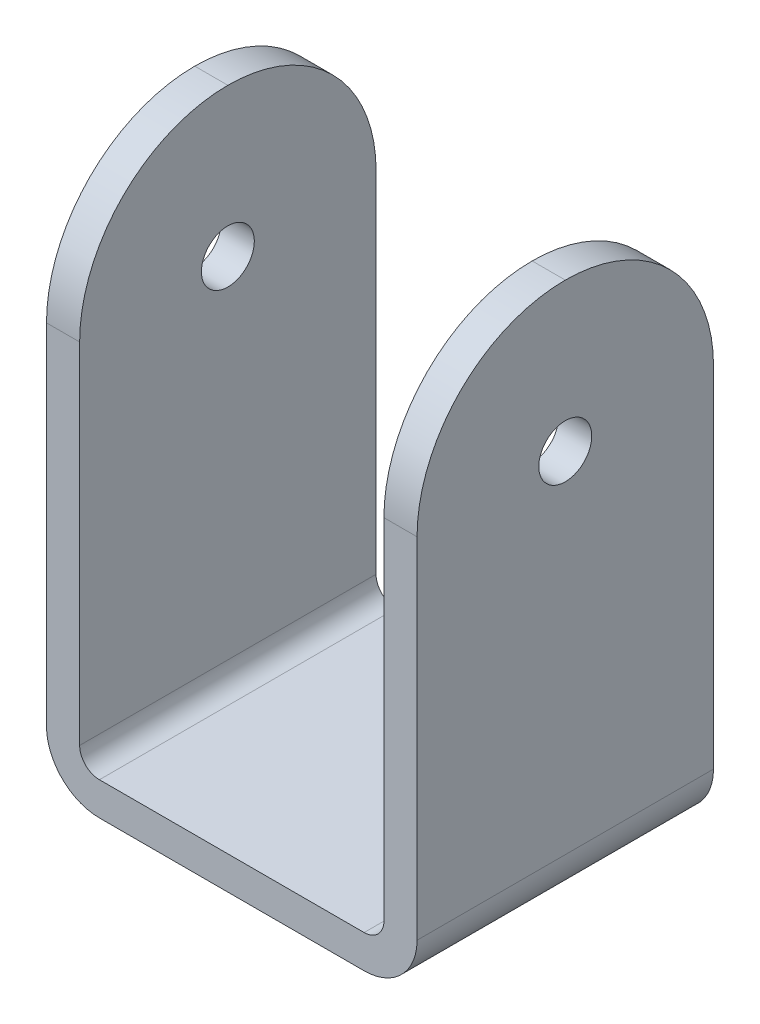
ISO-10303-21;
HEADER;
FILE_DESCRIPTION(('STEP AP214'),'2;1');
FILE_NAME('part.step','',(''),(''),'','','');
FILE_SCHEMA(('AUTOMOTIVE_DESIGN { 1 0 10303 214 1 1 1 1 }'));
ENDSEC;
DATA;
#1=APPLICATION_CONTEXT('core data for automotive mechanical design processes');
#2=APPLICATION_PROTOCOL_DEFINITION('international standard','automotive_design',2000,#1);
#3=PRODUCT_CONTEXT('',#1,'mechanical');
#4=PRODUCT('Part','Part','',(#3));
#5=PRODUCT_RELATED_PRODUCT_CATEGORY('part','',(#4));
#6=PRODUCT_DEFINITION_FORMATION('','',#4);
#7=PRODUCT_DEFINITION_CONTEXT('part definition',#1,'design');
#8=PRODUCT_DEFINITION('design','',#6,#7);
#9=PRODUCT_DEFINITION_SHAPE('','',#8);
#10=(LENGTH_UNIT() NAMED_UNIT(*) SI_UNIT(.MILLI.,.METRE.));
#11=(NAMED_UNIT(*) PLANE_ANGLE_UNIT() SI_UNIT($,.RADIAN.));
#12=(NAMED_UNIT(*) SI_UNIT($,.STERADIAN.) SOLID_ANGLE_UNIT());
#13=UNCERTAINTY_MEASURE_WITH_UNIT(LENGTH_MEASURE(1.E-05),#10,'distance_accuracy_value','');
#14=(GEOMETRIC_REPRESENTATION_CONTEXT(3) GLOBAL_UNCERTAINTY_ASSIGNED_CONTEXT((#13)) GLOBAL_UNIT_ASSIGNED_CONTEXT((#10,
#11,#12)) REPRESENTATION_CONTEXT('',''));
#15=CARTESIAN_POINT('',(0.,0.,0.));
#16=DIRECTION('',(0.,0.,1.));
#17=DIRECTION('',(1.,0.,0.));
#18=AXIS2_PLACEMENT_3D('',#15,#16,#17);
#19=CARTESIAN_POINT('',(-144.822728971963,103.115454205607,71.12));
#20=DIRECTION('',(1.,0.,0.));
#21=DIRECTION('',(0.,1.,0.));
#22=AXIS2_PLACEMENT_3D('',#19,#20,#21);
#23=PLANE('',#22);
#24=CARTESIAN_POINT('',(-144.822728971963,67.5554542056074,35.56));
#25=DIRECTION('',(1.,0.,0.));
#26=DIRECTION('',(0.,0.,-1.));
#27=AXIS2_PLACEMENT_3D('',#24,#25,#26);
#28=CIRCLE('',#27,6.35);
#29=CARTESIAN_POINT('',(-144.822728971963,67.5554542056074,29.21));
#30=VERTEX_POINT('',#29);
#31=EDGE_CURVE('E246',#30,#30,#28,.T.);
#32=ORIENTED_EDGE('',*,*,#31,.T.);
#33=EDGE_LOOP('',(#32));
#34=FACE_BOUND('',#33,.T.);
#35=CARTESIAN_POINT('',(-144.822728971962,67.5554542056074,35.56));
#36=DIRECTION('',(1.,0.,0.));
#37=DIRECTION('',(0.,1.,0.));
#38=AXIS2_PLACEMENT_3D('',#35,#36,#37);
#39=CIRCLE('',#38,35.56);
#40=CARTESIAN_POINT('',(-144.822728971962,67.5554542056074,71.12));
#41=VERTEX_POINT('',#40);
#42=CARTESIAN_POINT('',(-144.822728971963,103.115454205607,35.56));
#43=VERTEX_POINT('',#42);
#44=EDGE_CURVE('E57',#41,#43,#39,.F.);
#45=ORIENTED_EDGE('',*,*,#44,.T.);
#46=CARTESIAN_POINT('',(-144.822728971962,67.5554542056074,35.56));
#47=DIRECTION('',(1.,0.,0.));
#48=DIRECTION('',(0.,1.,0.));
#49=AXIS2_PLACEMENT_3D('',#46,#47,#48);
#50=CIRCLE('',#49,35.56);
#51=CARTESIAN_POINT('',(-144.822728971962,67.5554542056074,0.));
#52=VERTEX_POINT('',#51);
#53=EDGE_CURVE('E233',#43,#52,#50,.F.);
#54=ORIENTED_EDGE('',*,*,#53,.T.);
#55=DIRECTION('',(0.,-1.,0.));
#56=VECTOR('',#55,1.);
#57=CARTESIAN_POINT('',(-144.822728971963,103.115454205607,0.));
#58=LINE('',#57,#56);
#59=CARTESIAN_POINT('',(-144.822728971962,-16.2645457943926,0.));
#60=VERTEX_POINT('',#59);
#61=EDGE_CURVE('E149',#52,#60,#58,.T.);
#62=ORIENTED_EDGE('',*,*,#61,.T.);
#63=DIRECTION('',(0.,0.,-1.));
#64=VECTOR('',#63,1.);
#65=CARTESIAN_POINT('',(-144.822728971962,-16.2645457943926,71.12));
#66=LINE('',#65,#64);
#67=CARTESIAN_POINT('',(-144.822728971962,-16.2645457943926,71.12));
#68=VERTEX_POINT('',#67);
#69=EDGE_CURVE('E147',#68,#60,#66,.T.);
#70=ORIENTED_EDGE('',*,*,#69,.F.);
#71=DIRECTION('',(0.,-1.,0.));
#72=VECTOR('',#71,1.);
#73=CARTESIAN_POINT('',(-144.822728971963,103.115454205607,71.12));
#74=LINE('',#73,#72);
#75=EDGE_CURVE('E134',#41,#68,#74,.T.);
#76=ORIENTED_EDGE('',*,*,#75,.F.);
#77=EDGE_LOOP('',(#45,#54,#62,#70,#76));
#78=FACE_BOUND('',#77,.T.);
#79=ADVANCED_FACE('F34',(#34,#78),#23,.F.);
#80=CARTESIAN_POINT('',(-132.122728971962,-16.2645457943926,71.12));
#81=DIRECTION('',(0.,0.,-1.));
#82=DIRECTION('',(-1.,0.,0.));
#83=AXIS2_PLACEMENT_3D('',#80,#81,#82);
#84=CYLINDRICAL_SURFACE('',#83,12.7);
#85=CARTESIAN_POINT('',(-132.122728971962,-16.2645457943926,0.));
#86=DIRECTION('',(0.,0.,1.));
#87=DIRECTION('',(1.,0.,0.));
#88=AXIS2_PLACEMENT_3D('',#85,#86,#87);
#89=CIRCLE('',#88,12.7);
#90=CARTESIAN_POINT('',(-132.122728971962,-28.9645457943926,0.));
#91=VERTEX_POINT('',#90);
#92=EDGE_CURVE('E178',#60,#91,#89,.T.);
#93=ORIENTED_EDGE('',*,*,#92,.T.);
#94=DIRECTION('',(0.,0.,-1.));
#95=VECTOR('',#94,1.);
#96=CARTESIAN_POINT('',(-132.122728971962,-28.9645457943926,71.12));
#97=LINE('',#96,#95);
#98=CARTESIAN_POINT('',(-132.122728971962,-28.9645457943926,71.12));
#99=VERTEX_POINT('',#98);
#100=EDGE_CURVE('E152',#99,#91,#97,.T.);
#101=ORIENTED_EDGE('',*,*,#100,.F.);
#102=CARTESIAN_POINT('',(-132.122728971962,-16.2645457943926,71.12));
#103=DIRECTION('',(0.,0.,1.));
#104=DIRECTION('',(1.,0.,0.));
#105=AXIS2_PLACEMENT_3D('',#102,#103,#104);
#106=CIRCLE('',#105,12.7);
#107=EDGE_CURVE('E139',#68,#99,#106,.T.);
#108=ORIENTED_EDGE('',*,*,#107,.F.);
#109=ORIENTED_EDGE('',*,*,#69,.T.);
#110=EDGE_LOOP('',(#93,#101,#108,#109));
#111=FACE_BOUND('',#110,.T.);
#112=ADVANCED_FACE('F154',(#111),#84,.T.);
#113=CARTESIAN_POINT('',(-132.122728971962,-28.9645457943926,71.12));
#114=DIRECTION('',(0.,1.,0.));
#115=DIRECTION('',(0.,0.,1.));
#116=AXIS2_PLACEMENT_3D('',#113,#114,#115);
#117=PLANE('',#116);
#118=DIRECTION('',(1.,0.,0.));
#119=VECTOR('',#118,1.);
#120=CARTESIAN_POINT('',(-132.122728971962,-28.9645457943926,0.));
#121=LINE('',#120,#119);
#122=CARTESIAN_POINT('',(-68.6227289719627,-28.9645457943926,0.));
#123=VERTEX_POINT('',#122);
#124=EDGE_CURVE('E181',#91,#123,#121,.T.);
#125=ORIENTED_EDGE('',*,*,#124,.T.);
#126=DIRECTION('',(0.,0.,-1.));
#127=VECTOR('',#126,1.);
#128=CARTESIAN_POINT('',(-68.6227289719627,-28.9645457943926,71.12));
#129=LINE('',#128,#127);
#130=CARTESIAN_POINT('',(-68.6227289719627,-28.9645457943926,71.12));
#131=VERTEX_POINT('',#130);
#132=EDGE_CURVE('E211',#131,#123,#129,.T.);
#133=ORIENTED_EDGE('',*,*,#132,.F.);
#134=DIRECTION('',(1.,0.,0.));
#135=VECTOR('',#134,1.);
#136=CARTESIAN_POINT('',(-132.122728971962,-28.9645457943926,71.12));
#137=LINE('',#136,#135);
#138=EDGE_CURVE('E157',#99,#131,#137,.T.);
#139=ORIENTED_EDGE('',*,*,#138,.F.);
#140=ORIENTED_EDGE('',*,*,#100,.T.);
#141=EDGE_LOOP('',(#125,#133,#139,#140));
#142=FACE_BOUND('',#141,.T.);
#143=ADVANCED_FACE('F288',(#142),#117,.F.);
#144=CARTESIAN_POINT('',(-68.6227289719626,-16.2645457943926,71.12));
#145=DIRECTION('',(0.,0.,-1.));
#146=DIRECTION('',(-1.,0.,0.));
#147=AXIS2_PLACEMENT_3D('',#144,#145,#146);
#148=CYLINDRICAL_SURFACE('',#147,12.7);
#149=CARTESIAN_POINT('',(-68.6227289719626,-16.2645457943926,0.));
#150=DIRECTION('',(0.,0.,1.));
#151=DIRECTION('',(1.,0.,0.));
#152=AXIS2_PLACEMENT_3D('',#149,#150,#151);
#153=CIRCLE('',#152,12.7);
#154=CARTESIAN_POINT('',(-55.9227289719626,-16.2645457943926,0.));
#155=VERTEX_POINT('',#154);
#156=EDGE_CURVE('E183',#123,#155,#153,.T.);
#157=ORIENTED_EDGE('',*,*,#156,.T.);
#158=DIRECTION('',(0.,0.,-1.));
#159=VECTOR('',#158,1.);
#160=CARTESIAN_POINT('',(-55.9227289719626,-16.2645457943926,71.12));
#161=LINE('',#160,#159);
#162=CARTESIAN_POINT('',(-55.9227289719626,-16.2645457943926,71.12));
#163=VERTEX_POINT('',#162);
#164=EDGE_CURVE('E208',#163,#155,#161,.T.);
#165=ORIENTED_EDGE('',*,*,#164,.F.);
#166=CARTESIAN_POINT('',(-68.6227289719626,-16.2645457943926,71.12));
#167=DIRECTION('',(0.,0.,1.));
#168=DIRECTION('',(1.,0.,0.));
#169=AXIS2_PLACEMENT_3D('',#166,#167,#168);
#170=CIRCLE('',#169,12.7);
#171=EDGE_CURVE('E159',#131,#163,#170,.T.);
#172=ORIENTED_EDGE('',*,*,#171,.F.);
#173=ORIENTED_EDGE('',*,*,#132,.T.);
#174=EDGE_LOOP('',(#157,#165,#172,#173));
#175=FACE_BOUND('',#174,.T.);
#176=ADVANCED_FACE('F315',(#175),#148,.T.);
#177=CARTESIAN_POINT('',(-55.9227289719626,-16.2645457943925,71.12));
#178=DIRECTION('',(-1.,0.,0.));
#179=DIRECTION('',(0.,0.,1.));
#180=AXIS2_PLACEMENT_3D('',#177,#178,#179);
#181=PLANE('',#180);
#182=CARTESIAN_POINT('',(-55.9227289719626,67.5554542056074,35.56));
#183=DIRECTION('',(1.,0.,0.));
#184=DIRECTION('',(0.,0.,-1.));
#185=AXIS2_PLACEMENT_3D('',#182,#183,#184);
#186=CIRCLE('',#185,6.35);
#187=CARTESIAN_POINT('',(-55.9227289719626,67.5554542056074,29.21));
#188=VERTEX_POINT('',#187);
#189=EDGE_CURVE('E248',#188,#188,#186,.T.);
#190=ORIENTED_EDGE('',*,*,#189,.F.);
#191=EDGE_LOOP('',(#190));
#192=FACE_BOUND('',#191,.T.);
#193=CARTESIAN_POINT('',(-55.9227289719626,67.5554542056074,35.56));
#194=DIRECTION('',(-1.,0.,0.));
#195=DIRECTION('',(0.,0.,1.));
#196=AXIS2_PLACEMENT_3D('',#193,#194,#195);
#197=CIRCLE('',#196,35.56);
#198=CARTESIAN_POINT('',(-55.9227289719626,67.5554542056074,0.));
#199=VERTEX_POINT('',#198);
#200=CARTESIAN_POINT('',(-55.9227289719626,103.115454205607,35.56));
#201=VERTEX_POINT('',#200);
#202=EDGE_CURVE('E223',#199,#201,#197,.F.);
#203=ORIENTED_EDGE('',*,*,#202,.T.);
#204=CARTESIAN_POINT('',(-55.9227289719626,67.5554542056074,35.56));
#205=DIRECTION('',(-1.,0.,0.));
#206=DIRECTION('',(0.,0.,1.));
#207=AXIS2_PLACEMENT_3D('',#204,#205,#206);
#208=CIRCLE('',#207,35.56);
#209=CARTESIAN_POINT('',(-55.9227289719626,67.5554542056074,71.12));
#210=VERTEX_POINT('',#209);
#211=EDGE_CURVE('E225',#201,#210,#208,.F.);
#212=ORIENTED_EDGE('',*,*,#211,.T.);
#213=DIRECTION('',(0.,1.,0.));
#214=VECTOR('',#213,1.);
#215=CARTESIAN_POINT('',(-55.9227289719626,-16.2645457943925,71.12));
#216=LINE('',#215,#214);
#217=EDGE_CURVE('E164',#163,#210,#216,.T.);
#218=ORIENTED_EDGE('',*,*,#217,.F.);
#219=ORIENTED_EDGE('',*,*,#164,.T.);
#220=DIRECTION('',(0.,1.,0.));
#221=VECTOR('',#220,1.);
#222=CARTESIAN_POINT('',(-55.9227289719626,-16.2645457943925,0.));
#223=LINE('',#222,#221);
#224=EDGE_CURVE('E185',#155,#199,#223,.T.);
#225=ORIENTED_EDGE('',*,*,#224,.T.);
#226=EDGE_LOOP('',(#203,#212,#218,#219,#225));
#227=FACE_BOUND('',#226,.T.);
#228=ADVANCED_FACE('F309',(#192,#227),#181,.F.);
#229=CARTESIAN_POINT('',(-63.8729289719626,-16.2645457943925,71.12));
#230=DIRECTION('',(1.,0.,0.));
#231=DIRECTION('',(0.,0.,-1.));
#232=AXIS2_PLACEMENT_3D('',#229,#230,#231);
#233=PLANE('',#232);
#234=CARTESIAN_POINT('',(-63.8729289719626,67.5554542056074,35.56));
#235=DIRECTION('',(1.,0.,0.));
#236=DIRECTION('',(0.,0.,-1.));
#237=AXIS2_PLACEMENT_3D('',#234,#235,#236);
#238=CIRCLE('',#237,6.35);
#239=CARTESIAN_POINT('',(-63.8729289719626,67.5554542056074,29.21));
#240=VERTEX_POINT('',#239);
#241=EDGE_CURVE('E239',#240,#240,#238,.T.);
#242=ORIENTED_EDGE('',*,*,#241,.T.);
#243=EDGE_LOOP('',(#242));
#244=FACE_BOUND('',#243,.T.);
#245=DIRECTION('',(0.,-1.,0.));
#246=VECTOR('',#245,1.);
#247=CARTESIAN_POINT('',(-63.8729289719626,-16.2645457943925,71.12));
#248=LINE('',#247,#246);
#249=CARTESIAN_POINT('',(-63.8729289719626,67.5554542056074,71.12));
#250=VERTEX_POINT('',#249);
#251=CARTESIAN_POINT('',(-63.8729289719626,-16.2645457943925,71.12));
#252=VERTEX_POINT('',#251);
#253=EDGE_CURVE('E166',#250,#252,#248,.T.);
#254=ORIENTED_EDGE('',*,*,#253,.F.);
#255=CARTESIAN_POINT('',(-63.8729289719626,67.5554542056074,35.56));
#256=DIRECTION('',(1.,0.,0.));
#257=DIRECTION('',(0.,0.,-1.));
#258=AXIS2_PLACEMENT_3D('',#255,#256,#257);
#259=CIRCLE('',#258,35.56);
#260=CARTESIAN_POINT('',(-63.8729289719626,103.115454205607,35.56));
#261=VERTEX_POINT('',#260);
#262=EDGE_CURVE('E221',#250,#261,#259,.F.);
#263=ORIENTED_EDGE('',*,*,#262,.T.);
#264=CARTESIAN_POINT('',(-63.8729289719626,67.5554542056074,35.56));
#265=DIRECTION('',(1.,0.,0.));
#266=DIRECTION('',(0.,0.,-1.));
#267=AXIS2_PLACEMENT_3D('',#264,#265,#266);
#268=CIRCLE('',#267,35.56);
#269=CARTESIAN_POINT('',(-63.8729289719626,67.5554542056074,0.));
#270=VERTEX_POINT('',#269);
#271=EDGE_CURVE('E219',#261,#270,#268,.F.);
#272=ORIENTED_EDGE('',*,*,#271,.T.);
#273=DIRECTION('',(0.,-1.,0.));
#274=VECTOR('',#273,1.);
#275=CARTESIAN_POINT('',(-63.8729289719626,-16.2645457943925,0.));
#276=LINE('',#275,#274);
#277=CARTESIAN_POINT('',(-63.8729289719626,-16.2645457943925,0.));
#278=VERTEX_POINT('',#277);
#279=EDGE_CURVE('E188',#270,#278,#276,.T.);
#280=ORIENTED_EDGE('',*,*,#279,.T.);
#281=DIRECTION('',(0.,0.,-1.));
#282=VECTOR('',#281,1.);
#283=CARTESIAN_POINT('',(-63.8729289719626,-16.2645457943925,71.12));
#284=LINE('',#283,#282);
#285=EDGE_CURVE('E205',#252,#278,#284,.T.);
#286=ORIENTED_EDGE('',*,*,#285,.F.);
#287=EDGE_LOOP('',(#254,#263,#272,#280,#286));
#288=FACE_BOUND('',#287,.T.);
#289=ADVANCED_FACE('F322',(#244,#288),#233,.F.);
#290=CARTESIAN_POINT('',(-68.6227289719626,-16.2645457943926,71.12));
#291=DIRECTION('',(0.,0.,-1.));
#292=DIRECTION('',(-1.,0.,0.));
#293=AXIS2_PLACEMENT_3D('',#290,#291,#292);
#294=CYLINDRICAL_SURFACE('',#293,4.7498);
#295=CARTESIAN_POINT('',(-68.6227289719626,-16.2645457943926,0.));
#296=DIRECTION('',(0.,0.,-1.));
#297=DIRECTION('',(1.,0.,0.));
#298=AXIS2_PLACEMENT_3D('',#295,#296,#297);
#299=CIRCLE('',#298,4.7498);
#300=CARTESIAN_POINT('',(-68.6227289719627,-21.0143457943925,0.));
#301=VERTEX_POINT('',#300);
#302=EDGE_CURVE('E190',#278,#301,#299,.T.);
#303=ORIENTED_EDGE('',*,*,#302,.T.);
#304=DIRECTION('',(0.,0.,-1.));
#305=VECTOR('',#304,1.);
#306=CARTESIAN_POINT('',(-68.6227289719627,-21.0143457943925,71.12));
#307=LINE('',#306,#305);
#308=CARTESIAN_POINT('',(-68.6227289719627,-21.0143457943925,71.12));
#309=VERTEX_POINT('',#308);
#310=EDGE_CURVE('E202',#309,#301,#307,.T.);
#311=ORIENTED_EDGE('',*,*,#310,.F.);
#312=CARTESIAN_POINT('',(-68.6227289719626,-16.2645457943926,71.12));
#313=DIRECTION('',(0.,0.,-1.));
#314=DIRECTION('',(1.,0.,0.));
#315=AXIS2_PLACEMENT_3D('',#312,#313,#314);
#316=CIRCLE('',#315,4.7498);
#317=EDGE_CURVE('E168',#252,#309,#316,.T.);
#318=ORIENTED_EDGE('',*,*,#317,.F.);
#319=ORIENTED_EDGE('',*,*,#285,.T.);
#320=EDGE_LOOP('',(#303,#311,#318,#319));
#321=FACE_BOUND('',#320,.T.);
#322=ADVANCED_FACE('F325',(#321),#294,.F.);
#323=CARTESIAN_POINT('',(-132.122728971962,-21.0143457943926,71.12));
#324=DIRECTION('',(0.,-1.,0.));
#325=DIRECTION('',(1.,0.,0.));
#326=AXIS2_PLACEMENT_3D('',#323,#324,#325);
#327=PLANE('',#326);
#328=DIRECTION('',(-1.,0.,0.));
#329=VECTOR('',#328,1.);
#330=CARTESIAN_POINT('',(-132.122728971962,-21.0143457943926,0.));
#331=LINE('',#330,#329);
#332=CARTESIAN_POINT('',(-132.122728971962,-21.0143457943926,0.));
#333=VERTEX_POINT('',#332);
#334=EDGE_CURVE('E192',#301,#333,#331,.T.);
#335=ORIENTED_EDGE('',*,*,#334,.T.);
#336=DIRECTION('',(0.,0.,-1.));
#337=VECTOR('',#336,1.);
#338=CARTESIAN_POINT('',(-132.122728971962,-21.0143457943926,71.12));
#339=LINE('',#338,#337);
#340=CARTESIAN_POINT('',(-132.122728971962,-21.0143457943926,71.12));
#341=VERTEX_POINT('',#340);
#342=EDGE_CURVE('E199',#341,#333,#339,.T.);
#343=ORIENTED_EDGE('',*,*,#342,.F.);
#344=DIRECTION('',(-1.,0.,0.));
#345=VECTOR('',#344,1.);
#346=CARTESIAN_POINT('',(-132.122728971962,-21.0143457943926,71.12));
#347=LINE('',#346,#345);
#348=EDGE_CURVE('E170',#309,#341,#347,.T.);
#349=ORIENTED_EDGE('',*,*,#348,.F.);
#350=ORIENTED_EDGE('',*,*,#310,.T.);
#351=EDGE_LOOP('',(#335,#343,#349,#350));
#352=FACE_BOUND('',#351,.T.);
#353=ADVANCED_FACE('F331',(#352),#327,.F.);
#354=CARTESIAN_POINT('',(-132.122728971962,-16.2645457943926,71.12));
#355=DIRECTION('',(0.,0.,-1.));
#356=DIRECTION('',(-1.,0.,0.));
#357=AXIS2_PLACEMENT_3D('',#354,#355,#356);
#358=CYLINDRICAL_SURFACE('',#357,4.74980000000045);
#359=CARTESIAN_POINT('',(-132.122728971962,-16.2645457943926,0.));
#360=DIRECTION('',(0.,0.,-1.));
#361=DIRECTION('',(1.,0.,0.));
#362=AXIS2_PLACEMENT_3D('',#359,#360,#361);
#363=CIRCLE('',#362,4.74980000000045);
#364=CARTESIAN_POINT('',(-136.872528971962,-16.2645457943926,0.));
#365=VERTEX_POINT('',#364);
#366=EDGE_CURVE('E194',#333,#365,#363,.T.);
#367=ORIENTED_EDGE('',*,*,#366,.T.);
#368=DIRECTION('',(0.,0.,-1.));
#369=VECTOR('',#368,1.);
#370=CARTESIAN_POINT('',(-136.872528971962,-16.2645457943926,71.12));
#371=LINE('',#370,#369);
#372=CARTESIAN_POINT('',(-136.872528971962,-16.2645457943926,71.12));
#373=VERTEX_POINT('',#372);
#374=EDGE_CURVE('E176',#373,#365,#371,.T.);
#375=ORIENTED_EDGE('',*,*,#374,.F.);
#376=CARTESIAN_POINT('',(-132.122728971962,-16.2645457943926,71.12));
#377=DIRECTION('',(0.,0.,-1.));
#378=DIRECTION('',(1.,0.,0.));
#379=AXIS2_PLACEMENT_3D('',#376,#377,#378);
#380=CIRCLE('',#379,4.74980000000045);
#381=EDGE_CURVE('E172',#341,#373,#380,.T.);
#382=ORIENTED_EDGE('',*,*,#381,.F.);
#383=ORIENTED_EDGE('',*,*,#342,.T.);
#384=EDGE_LOOP('',(#367,#375,#382,#383));
#385=FACE_BOUND('',#384,.T.);
#386=ADVANCED_FACE('F265',(#385),#358,.F.);
#387=CARTESIAN_POINT('',(-136.872528971963,103.115454205607,71.12));
#388=DIRECTION('',(-1.,0.,0.));
#389=DIRECTION('',(0.,0.,1.));
#390=AXIS2_PLACEMENT_3D('',#387,#388,#389);
#391=PLANE('',#390);
#392=CARTESIAN_POINT('',(-136.872528971963,67.5554542056074,35.56));
#393=DIRECTION('',(-1.,0.,0.));
#394=DIRECTION('',(0.,0.,1.));
#395=AXIS2_PLACEMENT_3D('',#392,#393,#394);
#396=CIRCLE('',#395,6.35);
#397=CARTESIAN_POINT('',(-136.872528971963,67.5554542056074,41.91));
#398=VERTEX_POINT('',#397);
#399=EDGE_CURVE('E38',#398,#398,#396,.T.);
#400=ORIENTED_EDGE('',*,*,#399,.T.);
#401=EDGE_LOOP('',(#400));
#402=FACE_BOUND('',#401,.T.);
#403=DIRECTION('',(0.,1.,0.));
#404=VECTOR('',#403,1.);
#405=CARTESIAN_POINT('',(-136.872528971963,103.115454205607,0.));
#406=LINE('',#405,#404);
#407=CARTESIAN_POINT('',(-136.872528971963,67.5554542056074,0.));
#408=VERTEX_POINT('',#407);
#409=EDGE_CURVE('E144',#365,#408,#406,.T.);
#410=ORIENTED_EDGE('',*,*,#409,.T.);
#411=CARTESIAN_POINT('',(-136.872528971963,67.5554542056074,35.56));
#412=DIRECTION('',(-1.,0.,0.));
#413=DIRECTION('',(0.,0.,1.));
#414=AXIS2_PLACEMENT_3D('',#411,#412,#413);
#415=CIRCLE('',#414,35.56);
#416=CARTESIAN_POINT('',(-136.872528971963,103.115454205607,35.56));
#417=VERTEX_POINT('',#416);
#418=EDGE_CURVE('E11',#408,#417,#415,.F.);
#419=ORIENTED_EDGE('',*,*,#418,.T.);
#420=CARTESIAN_POINT('',(-136.872528971963,67.5554542056074,35.56));
#421=DIRECTION('',(-1.,0.,0.));
#422=DIRECTION('',(0.,0.,1.));
#423=AXIS2_PLACEMENT_3D('',#420,#421,#422);
#424=CIRCLE('',#423,35.56);
#425=CARTESIAN_POINT('',(-136.872528971963,67.5554542056074,71.12));
#426=VERTEX_POINT('',#425);
#427=EDGE_CURVE('E43',#417,#426,#424,.F.);
#428=ORIENTED_EDGE('',*,*,#427,.T.);
#429=DIRECTION('',(0.,1.,0.));
#430=VECTOR('',#429,1.);
#431=CARTESIAN_POINT('',(-136.872528971963,103.115454205607,71.12));
#432=LINE('',#431,#430);
#433=EDGE_CURVE('E174',#373,#426,#432,.T.);
#434=ORIENTED_EDGE('',*,*,#433,.F.);
#435=ORIENTED_EDGE('',*,*,#374,.T.);
#436=EDGE_LOOP('',(#410,#419,#428,#434,#435));
#437=FACE_BOUND('',#436,.T.);
#438=ADVANCED_FACE('F263',(#402,#437),#391,.F.);
#439=CARTESIAN_POINT('',(-132.122728971962,-16.2645457943926,71.12));
#440=DIRECTION('',(0.,0.,1.));
#441=DIRECTION('',(1.,0.,0.));
#442=AXIS2_PLACEMENT_3D('',#439,#440,#441);
#443=PLANE('',#442);
#444=ORIENTED_EDGE('',*,*,#217,.T.);
#445=DIRECTION('',(-1.,0.,0.));
#446=VECTOR('',#445,1.);
#447=CARTESIAN_POINT('',(-63.8729289719625,67.5554542056074,71.12));
#448=LINE('',#447,#446);
#449=EDGE_CURVE('E216',#210,#250,#448,.T.);
#450=ORIENTED_EDGE('',*,*,#449,.T.);
#451=ORIENTED_EDGE('',*,*,#253,.T.);
#452=ORIENTED_EDGE('',*,*,#317,.T.);
#453=ORIENTED_EDGE('',*,*,#348,.T.);
#454=ORIENTED_EDGE('',*,*,#381,.T.);
#455=ORIENTED_EDGE('',*,*,#433,.T.);
#456=DIRECTION('',(-1.,0.,0.));
#457=VECTOR('',#456,1.);
#458=CARTESIAN_POINT('',(-144.822728971963,67.5554542056074,71.12));
#459=LINE('',#458,#457);
#460=EDGE_CURVE('E143',#426,#41,#459,.T.);
#461=ORIENTED_EDGE('',*,*,#460,.T.);
#462=ORIENTED_EDGE('',*,*,#75,.T.);
#463=ORIENTED_EDGE('',*,*,#107,.T.);
#464=ORIENTED_EDGE('',*,*,#138,.T.);
#465=ORIENTED_EDGE('',*,*,#171,.T.);
#466=EDGE_LOOP('',(#444,#450,#451,#452,#453,#454,#455,#461,#462,#463,#464,#465));
#467=FACE_BOUND('',#466,.T.);
#468=ADVANCED_FACE('F137',(#467),#443,.T.);
#469=CARTESIAN_POINT('',(-132.122728971962,-16.2645457943926,0.));
#470=DIRECTION('',(0.,0.,1.));
#471=DIRECTION('',(1.,0.,0.));
#472=AXIS2_PLACEMENT_3D('',#469,#470,#471);
#473=PLANE('',#472);
#474=ORIENTED_EDGE('',*,*,#279,.F.);
#475=DIRECTION('',(-1.,0.,0.));
#476=VECTOR('',#475,1.);
#477=CARTESIAN_POINT('',(-132.122728971962,67.5554542056073,0.));
#478=LINE('',#477,#476);
#479=EDGE_CURVE('E230',#270,#199,#478,.F.);
#480=ORIENTED_EDGE('',*,*,#479,.T.);
#481=ORIENTED_EDGE('',*,*,#224,.F.);
#482=ORIENTED_EDGE('',*,*,#156,.F.);
#483=ORIENTED_EDGE('',*,*,#124,.F.);
#484=ORIENTED_EDGE('',*,*,#92,.F.);
#485=ORIENTED_EDGE('',*,*,#61,.F.);
#486=DIRECTION('',(-1.,0.,0.));
#487=VECTOR('',#486,1.);
#488=CARTESIAN_POINT('',(-132.122728971962,67.5554542056074,0.));
#489=LINE('',#488,#487);
#490=EDGE_CURVE('E227',#52,#408,#489,.F.);
#491=ORIENTED_EDGE('',*,*,#490,.T.);
#492=ORIENTED_EDGE('',*,*,#409,.F.);
#493=ORIENTED_EDGE('',*,*,#366,.F.);
#494=ORIENTED_EDGE('',*,*,#334,.F.);
#495=ORIENTED_EDGE('',*,*,#302,.F.);
#496=EDGE_LOOP('',(#474,#480,#481,#482,#483,#484,#485,#491,#492,#493,#494,#495));
#497=FACE_BOUND('',#496,.T.);
#498=ADVANCED_FACE('F273',(#497),#473,.F.);
#499=CARTESIAN_POINT('',(-63.8729289719625,67.5554542056074,35.56));
#500=DIRECTION('',(-1.,0.,0.));
#501=DIRECTION('',(0.,-1.,0.));
#502=AXIS2_PLACEMENT_3D('',#499,#500,#501);
#503=CYLINDRICAL_SURFACE('',#502,35.56);
#504=DIRECTION('',(-1.,0.,0.));
#505=VECTOR('',#504,1.);
#506=CARTESIAN_POINT('',(-63.8729289719626,103.115454205607,35.56));
#507=LINE('',#506,#505);
#508=EDGE_CURVE('E179',#201,#261,#507,.T.);
#509=ORIENTED_EDGE('',*,*,#508,.F.);
#510=ORIENTED_EDGE('',*,*,#202,.F.);
#511=ORIENTED_EDGE('',*,*,#479,.F.);
#512=ORIENTED_EDGE('',*,*,#271,.F.);
#513=EDGE_LOOP('',(#509,#510,#511,#512));
#514=FACE_BOUND('',#513,.T.);
#515=ADVANCED_FACE('F293',(#514),#503,.T.);
#516=CARTESIAN_POINT('',(-132.122728971962,67.5554542056073,35.56));
#517=DIRECTION('',(1.,0.,0.));
#518=DIRECTION('',(0.,1.,0.));
#519=AXIS2_PLACEMENT_3D('',#516,#517,#518);
#520=CYLINDRICAL_SURFACE('',#519,35.56);
#521=ORIENTED_EDGE('',*,*,#211,.F.);
#522=ORIENTED_EDGE('',*,*,#508,.T.);
#523=ORIENTED_EDGE('',*,*,#262,.F.);
#524=ORIENTED_EDGE('',*,*,#449,.F.);
#525=EDGE_LOOP('',(#521,#522,#523,#524));
#526=FACE_BOUND('',#525,.T.);
#527=ADVANCED_FACE('F280',(#526),#520,.T.);
#528=CARTESIAN_POINT('',(-132.122728971962,67.5554542056074,35.56));
#529=DIRECTION('',(1.,0.,0.));
#530=DIRECTION('',(0.,0.,-1.));
#531=AXIS2_PLACEMENT_3D('',#528,#529,#530);
#532=CYLINDRICAL_SURFACE('',#531,35.56);
#533=ORIENTED_EDGE('',*,*,#460,.F.);
#534=ORIENTED_EDGE('',*,*,#427,.F.);
#535=DIRECTION('',(-1.,0.,0.));
#536=VECTOR('',#535,1.);
#537=CARTESIAN_POINT('',(-136.872528971963,103.115454205607,35.56));
#538=LINE('',#537,#536);
#539=EDGE_CURVE('E237',#43,#417,#538,.F.);
#540=ORIENTED_EDGE('',*,*,#539,.F.);
#541=ORIENTED_EDGE('',*,*,#44,.F.);
#542=EDGE_LOOP('',(#533,#534,#540,#541));
#543=FACE_BOUND('',#542,.T.);
#544=ADVANCED_FACE('F36',(#543),#532,.T.);
#545=CARTESIAN_POINT('',(-144.822728971963,67.5554542056074,35.56));
#546=DIRECTION('',(-1.,0.,0.));
#547=DIRECTION('',(0.,0.,1.));
#548=AXIS2_PLACEMENT_3D('',#545,#546,#547);
#549=CYLINDRICAL_SURFACE('',#548,35.56);
#550=ORIENTED_EDGE('',*,*,#418,.F.);
#551=ORIENTED_EDGE('',*,*,#490,.F.);
#552=ORIENTED_EDGE('',*,*,#53,.F.);
#553=ORIENTED_EDGE('',*,*,#539,.T.);
#554=EDGE_LOOP('',(#550,#551,#552,#553));
#555=FACE_BOUND('',#554,.T.);
#556=ADVANCED_FACE('F259',(#555),#549,.T.);
#557=CARTESIAN_POINT('',(-144.822728971963,67.5554542056074,35.56));
#558=DIRECTION('',(1.,0.,0.));
#559=DIRECTION('',(0.,0.,-1.));
#560=AXIS2_PLACEMENT_3D('',#557,#558,#559);
#561=CYLINDRICAL_SURFACE('',#560,6.35);
#562=ORIENTED_EDGE('',*,*,#31,.F.);
#563=EDGE_LOOP('',(#562));
#564=FACE_BOUND('',#563,.T.);
#565=ORIENTED_EDGE('',*,*,#399,.F.);
#566=EDGE_LOOP('',(#565));
#567=FACE_BOUND('',#566,.T.);
#568=ADVANCED_FACE('F255',(#564,#567),#561,.F.);
#569=ORIENTED_EDGE('',*,*,#189,.T.);
#570=EDGE_LOOP('',(#569));
#571=FACE_BOUND('',#570,.T.);
#572=ORIENTED_EDGE('',*,*,#241,.F.);
#573=EDGE_LOOP('',(#572));
#574=FACE_BOUND('',#573,.T.);
#575=ADVANCED_FACE('F258',(#571,#574),#561,.F.);
#576=CLOSED_SHELL('',(#79,#112,#143,#176,#228,#289,#322,#353,#386,#438,#468,#498,#515,#527,#544,
#556,#568,#575));
#577=MANIFOLD_SOLID_BREP('B2',#576);
#578=ADVANCED_BREP_SHAPE_REPRESENTATION('',(#18,#577),#14);
#579=SHAPE_DEFINITION_REPRESENTATION(#9,#578);
ENDSEC;
END-ISO-10303-21;
